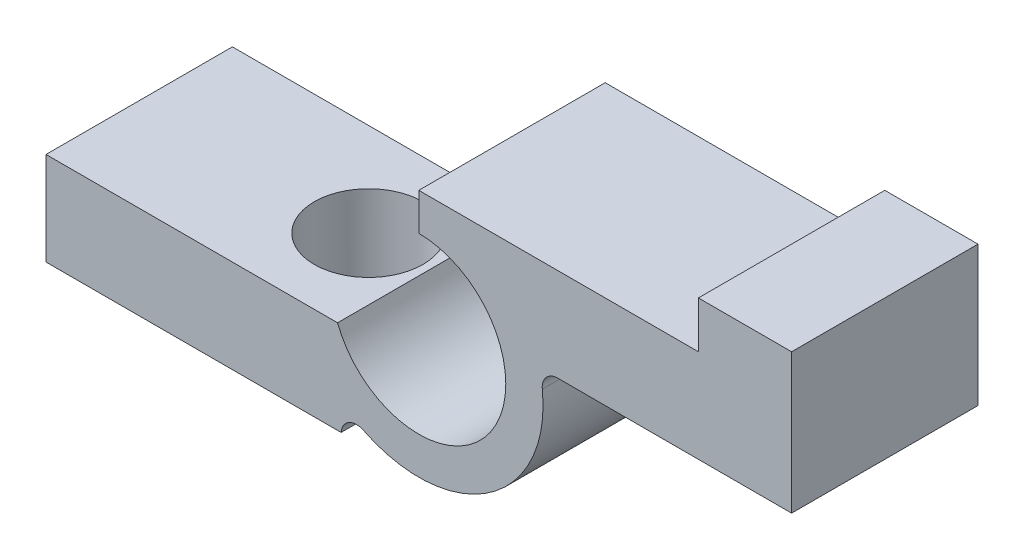
ISO-10303-21;
HEADER;
FILE_DESCRIPTION(('STEP AP214'),'2;1');
FILE_NAME('part.step','',(''),(''),'','','');
FILE_SCHEMA(('AUTOMOTIVE_DESIGN { 1 0 10303 214 1 1 1 1 }'));
ENDSEC;
DATA;
#1=APPLICATION_CONTEXT('core data for automotive mechanical design processes');
#2=APPLICATION_PROTOCOL_DEFINITION('international standard','automotive_design',2000,#1);
#3=PRODUCT_CONTEXT('',#1,'mechanical');
#4=PRODUCT('Part','Part','',(#3));
#5=PRODUCT_RELATED_PRODUCT_CATEGORY('part','',(#4));
#6=PRODUCT_DEFINITION_FORMATION('','',#4);
#7=PRODUCT_DEFINITION_CONTEXT('part definition',#1,'design');
#8=PRODUCT_DEFINITION('design','',#6,#7);
#9=PRODUCT_DEFINITION_SHAPE('','',#8);
#10=(LENGTH_UNIT() NAMED_UNIT(*) SI_UNIT(.MILLI.,.METRE.));
#11=(NAMED_UNIT(*) PLANE_ANGLE_UNIT() SI_UNIT($,.RADIAN.));
#12=(NAMED_UNIT(*) SI_UNIT($,.STERADIAN.) SOLID_ANGLE_UNIT());
#13=UNCERTAINTY_MEASURE_WITH_UNIT(LENGTH_MEASURE(1.E-05),#10,'distance_accuracy_value','');
#14=(GEOMETRIC_REPRESENTATION_CONTEXT(3) GLOBAL_UNCERTAINTY_ASSIGNED_CONTEXT((#13)) GLOBAL_UNIT_ASSIGNED_CONTEXT((#10,
#11,#12)) REPRESENTATION_CONTEXT('',''));
#15=CARTESIAN_POINT('',(0.,0.,0.));
#16=DIRECTION('',(0.,0.,1.));
#17=DIRECTION('',(1.,0.,0.));
#18=AXIS2_PLACEMENT_3D('',#15,#16,#17);
#19=CARTESIAN_POINT('',(0.,8.,6.));
#20=DIRECTION('',(0.,-1.,0.));
#21=DIRECTION('',(0.,0.,-1.));
#22=AXIS2_PLACEMENT_3D('',#19,#20,#21);
#23=PLANE('',#22);
#24=DIRECTION('',(0.,0.,1.));
#25=VECTOR('',#24,1.);
#26=CARTESIAN_POINT('',(18.,8.,0.));
#27=LINE('',#26,#25);
#28=CARTESIAN_POINT('',(18.,8.,0.));
#29=VERTEX_POINT('',#28);
#30=CARTESIAN_POINT('',(18.,8.,6.));
#31=VERTEX_POINT('',#30);
#32=EDGE_CURVE('E55',#29,#31,#27,.T.);
#33=ORIENTED_EDGE('',*,*,#32,.F.);
#34=DIRECTION('',(-1.,0.,0.));
#35=VECTOR('',#34,1.);
#36=CARTESIAN_POINT('',(0.,8.,0.));
#37=LINE('',#36,#35);
#38=CARTESIAN_POINT('',(9.,8.,0.));
#39=VERTEX_POINT('',#38);
#40=EDGE_CURVE('E159',#29,#39,#37,.T.);
#41=ORIENTED_EDGE('',*,*,#40,.T.);
#42=DIRECTION('',(0.,0.,-1.));
#43=VECTOR('',#42,1.);
#44=CARTESIAN_POINT('',(9.,8.,6.));
#45=LINE('',#44,#43);
#46=CARTESIAN_POINT('',(9.,8.,6.));
#47=VERTEX_POINT('',#46);
#48=EDGE_CURVE('E203',#47,#39,#45,.T.);
#49=ORIENTED_EDGE('',*,*,#48,.F.);
#50=DIRECTION('',(-1.,0.,0.));
#51=VECTOR('',#50,1.);
#52=CARTESIAN_POINT('',(0.,8.,6.));
#53=LINE('',#52,#51);
#54=EDGE_CURVE('E201',#31,#47,#53,.T.);
#55=ORIENTED_EDGE('',*,*,#54,.F.);
#56=EDGE_LOOP('',(#33,#41,#49,#55));
#57=FACE_BOUND('',#56,.T.);
#58=ADVANCED_FACE('F40',(#57),#23,.F.);
#59=CARTESIAN_POINT('',(0.,3.,6.));
#60=DIRECTION('',(0.,-1.,0.));
#61=DIRECTION('',(0.,0.,-1.));
#62=AXIS2_PLACEMENT_3D('',#59,#60,#61);
#63=PLANE('',#62);
#64=CARTESIAN_POINT('',(4.3846606338756,3.,3.));
#65=DIRECTION('',(0.,-1.,0.));
#66=DIRECTION('',(0.,0.,-1.));
#67=AXIS2_PLACEMENT_3D('',#64,#65,#66);
#68=CIRCLE('',#67,1.75);
#69=CARTESIAN_POINT('',(4.3846606338756,3.,1.25));
#70=VERTEX_POINT('',#69);
#71=EDGE_CURVE('E263',#70,#70,#68,.T.);
#72=ORIENTED_EDGE('',*,*,#71,.T.);
#73=EDGE_LOOP('',(#72));
#74=FACE_BOUND('',#73,.T.);
#75=DIRECTION('',(-1.,0.,0.));
#76=VECTOR('',#75,1.);
#77=CARTESIAN_POINT('',(0.,3.,0.));
#78=LINE('',#77,#76);
#79=CARTESIAN_POINT('',(6.3846606338756,3.,0.));
#80=VERTEX_POINT('',#79);
#81=CARTESIAN_POINT('',(-3.,3.,0.));
#82=VERTEX_POINT('',#81);
#83=EDGE_CURVE('E208',#80,#82,#78,.T.);
#84=ORIENTED_EDGE('',*,*,#83,.T.);
#85=DIRECTION('',(0.,0.,-1.));
#86=VECTOR('',#85,1.);
#87=CARTESIAN_POINT('',(-3.,3.,6.));
#88=LINE('',#87,#86);
#89=CARTESIAN_POINT('',(-3.,3.,6.));
#90=VERTEX_POINT('',#89);
#91=EDGE_CURVE('E172',#90,#82,#88,.T.);
#92=ORIENTED_EDGE('',*,*,#91,.F.);
#93=DIRECTION('',(-1.,0.,0.));
#94=VECTOR('',#93,1.);
#95=CARTESIAN_POINT('',(0.,3.,6.));
#96=LINE('',#95,#94);
#97=CARTESIAN_POINT('',(6.3846606338756,3.,6.));
#98=VERTEX_POINT('',#97);
#99=EDGE_CURVE('E197',#98,#90,#96,.T.);
#100=ORIENTED_EDGE('',*,*,#99,.F.);
#101=DIRECTION('',(0.,0.,-1.));
#102=VECTOR('',#101,1.);
#103=CARTESIAN_POINT('',(6.3846606338756,3.,6.));
#104=LINE('',#103,#102);
#105=EDGE_CURVE('E224',#80,#98,#104,.F.);
#106=ORIENTED_EDGE('',*,*,#105,.F.);
#107=EDGE_LOOP('',(#84,#92,#100,#106));
#108=FACE_BOUND('',#107,.T.);
#109=ADVANCED_FACE('F284',(#74,#108),#63,.F.);
#110=CARTESIAN_POINT('',(0.,0.,6.));
#111=DIRECTION('',(0.,1.,0.));
#112=DIRECTION('',(0.,0.,1.));
#113=AXIS2_PLACEMENT_3D('',#110,#111,#112);
#114=PLANE('',#113);
#115=CARTESIAN_POINT('',(4.3846606338756,0.,3.));
#116=DIRECTION('',(0.,1.,0.));
#117=DIRECTION('',(0.,0.,1.));
#118=AXIS2_PLACEMENT_3D('',#115,#116,#117);
#119=CIRCLE('',#118,1.75);
#120=CARTESIAN_POINT('',(4.3846606338756,0.,4.75));
#121=VERTEX_POINT('',#120);
#122=EDGE_CURVE('E265',#121,#121,#119,.T.);
#123=ORIENTED_EDGE('',*,*,#122,.T.);
#124=EDGE_LOOP('',(#123));
#125=FACE_BOUND('',#124,.T.);
#126=DIRECTION('',(1.,0.,0.));
#127=VECTOR('',#126,1.);
#128=CARTESIAN_POINT('',(0.,0.,0.));
#129=LINE('',#128,#127);
#130=CARTESIAN_POINT('',(-3.,0.,0.));
#131=VERTEX_POINT('',#130);
#132=CARTESIAN_POINT('',(6.5,0.,0.));
#133=VERTEX_POINT('',#132);
#134=EDGE_CURVE('E207',#131,#133,#129,.T.);
#135=ORIENTED_EDGE('',*,*,#134,.T.);
#136=DIRECTION('',(0.,0.,-1.));
#137=VECTOR('',#136,1.);
#138=CARTESIAN_POINT('',(6.5,0.,6.));
#139=LINE('',#138,#137);
#140=CARTESIAN_POINT('',(6.5,0.,6.));
#141=VERTEX_POINT('',#140);
#142=EDGE_CURVE('E216',#141,#133,#139,.T.);
#143=ORIENTED_EDGE('',*,*,#142,.F.);
#144=DIRECTION('',(1.,0.,0.));
#145=VECTOR('',#144,1.);
#146=CARTESIAN_POINT('',(0.,0.,6.));
#147=LINE('',#146,#145);
#148=CARTESIAN_POINT('',(-3.,0.,6.));
#149=VERTEX_POINT('',#148);
#150=EDGE_CURVE('E196',#149,#141,#147,.T.);
#151=ORIENTED_EDGE('',*,*,#150,.F.);
#152=DIRECTION('',(0.,0.,1.));
#153=VECTOR('',#152,1.);
#154=CARTESIAN_POINT('',(-3.,0.,0.));
#155=LINE('',#154,#153);
#156=EDGE_CURVE('E178',#131,#149,#155,.T.);
#157=ORIENTED_EDGE('',*,*,#156,.F.);
#158=EDGE_LOOP('',(#135,#143,#151,#157));
#159=FACE_BOUND('',#158,.T.);
#160=ADVANCED_FACE('F244',(#125,#159),#114,.F.);
#161=CARTESIAN_POINT('',(9.,4.,6.));
#162=DIRECTION('',(0.,0.,-1.));
#163=DIRECTION('',(-1.,0.,0.));
#164=AXIS2_PLACEMENT_3D('',#161,#162,#163);
#165=CYLINDRICAL_SURFACE('',#164,4.);
#166=CARTESIAN_POINT('',(9.,4.,0.));
#167=DIRECTION('',(0.,0.,1.));
#168=DIRECTION('',(1.,0.,0.));
#169=AXIS2_PLACEMENT_3D('',#166,#167,#168);
#170=CIRCLE('',#169,4.);
#171=CARTESIAN_POINT('',(7.22138574685198,0.417189463773072,0.));
#172=VERTEX_POINT('',#171);
#173=CARTESIAN_POINT('',(12.9752319599996,4.44444444444445,0.));
#174=VERTEX_POINT('',#173);
#175=EDGE_CURVE('E204',#172,#174,#170,.T.);
#176=ORIENTED_EDGE('',*,*,#175,.T.);
#177=DIRECTION('',(0.,0.,-1.));
#178=VECTOR('',#177,1.);
#179=CARTESIAN_POINT('',(12.9752319599996,4.44444444444445,6.));
#180=LINE('',#179,#178);
#181=CARTESIAN_POINT('',(12.9752319599996,4.44444444444445,6.));
#182=VERTEX_POINT('',#181);
#183=EDGE_CURVE('E63',#174,#182,#180,.F.);
#184=ORIENTED_EDGE('',*,*,#183,.T.);
#185=CARTESIAN_POINT('',(9.,4.,6.));
#186=DIRECTION('',(0.,0.,1.));
#187=DIRECTION('',(1.,0.,0.));
#188=AXIS2_PLACEMENT_3D('',#185,#186,#187);
#189=CIRCLE('',#188,4.);
#190=CARTESIAN_POINT('',(7.22138574685198,0.417189463773072,6.));
#191=VERTEX_POINT('',#190);
#192=EDGE_CURVE('E193',#191,#182,#189,.T.);
#193=ORIENTED_EDGE('',*,*,#192,.F.);
#194=DIRECTION('',(0.,0.,-1.));
#195=VECTOR('',#194,1.);
#196=CARTESIAN_POINT('',(7.22138574685198,0.417189463773072,6.));
#197=LINE('',#196,#195);
#198=EDGE_CURVE('E230',#191,#172,#197,.T.);
#199=ORIENTED_EDGE('',*,*,#198,.T.);
#200=EDGE_LOOP('',(#176,#184,#193,#199));
#201=FACE_BOUND('',#200,.T.);
#202=ADVANCED_FACE('F250',(#201),#165,.T.);
#203=CARTESIAN_POINT('',(0.,5.,6.));
#204=DIRECTION('',(0.,1.,0.));
#205=DIRECTION('',(0.,0.,1.));
#206=AXIS2_PLACEMENT_3D('',#203,#204,#205);
#207=PLANE('',#206);
#208=DIRECTION('',(1.,0.,0.));
#209=VECTOR('',#208,1.);
#210=CARTESIAN_POINT('',(0.,5.,6.));
#211=LINE('',#210,#209);
#212=CARTESIAN_POINT('',(13.4721359549996,5.,6.));
#213=VERTEX_POINT('',#212);
#214=CARTESIAN_POINT('',(21.,5.,6.));
#215=VERTEX_POINT('',#214);
#216=EDGE_CURVE('E195',#213,#215,#211,.T.);
#217=ORIENTED_EDGE('',*,*,#216,.F.);
#218=DIRECTION('',(0.,0.,1.));
#219=VECTOR('',#218,1.);
#220=CARTESIAN_POINT('',(13.4721359549996,5.,0.));
#221=LINE('',#220,#219);
#222=CARTESIAN_POINT('',(13.4721359549996,5.,0.));
#223=VERTEX_POINT('',#222);
#224=EDGE_CURVE('E227',#213,#223,#221,.F.);
#225=ORIENTED_EDGE('',*,*,#224,.T.);
#226=DIRECTION('',(1.,0.,0.));
#227=VECTOR('',#226,1.);
#228=CARTESIAN_POINT('',(0.,5.,0.));
#229=LINE('',#228,#227);
#230=CARTESIAN_POINT('',(21.,5.,0.));
#231=VERTEX_POINT('',#230);
#232=EDGE_CURVE('E206',#223,#231,#229,.T.);
#233=ORIENTED_EDGE('',*,*,#232,.T.);
#234=DIRECTION('',(0.,0.,-1.));
#235=VECTOR('',#234,1.);
#236=CARTESIAN_POINT('',(21.,5.,6.));
#237=LINE('',#236,#235);
#238=EDGE_CURVE('E160',#215,#231,#237,.T.);
#239=ORIENTED_EDGE('',*,*,#238,.F.);
#240=EDGE_LOOP('',(#217,#225,#233,#239));
#241=FACE_BOUND('',#240,.T.);
#242=ADVANCED_FACE('F257',(#241),#207,.F.);
#243=CARTESIAN_POINT('',(0.,0.,6.));
#244=DIRECTION('',(0.,0.,1.));
#245=DIRECTION('',(1.,0.,0.));
#246=AXIS2_PLACEMENT_3D('',#243,#244,#245);
#247=PLANE('',#246);
#248=CARTESIAN_POINT('',(9.,4.,6.));
#249=DIRECTION('',(0.,0.,-1.));
#250=DIRECTION('',(-1.,0.,0.));
#251=AXIS2_PLACEMENT_3D('',#248,#249,#250);
#252=CIRCLE('',#251,2.8);
#253=CARTESIAN_POINT('',(9.,6.8,6.));
#254=VERTEX_POINT('',#253);
#255=EDGE_CURVE('E189',#254,#98,#252,.T.);
#256=ORIENTED_EDGE('',*,*,#255,.T.);
#257=ORIENTED_EDGE('',*,*,#99,.T.);
#258=DIRECTION('',(0.,1.,0.));
#259=VECTOR('',#258,1.);
#260=CARTESIAN_POINT('',(-3.,0.,6.));
#261=LINE('',#260,#259);
#262=EDGE_CURVE('E181',#149,#90,#261,.T.);
#263=ORIENTED_EDGE('',*,*,#262,.F.);
#264=ORIENTED_EDGE('',*,*,#150,.T.);
#265=CARTESIAN_POINT('',(6.99905896520847,-0.0306618532552948,6.));
#266=DIRECTION('',(0.,0.,1.));
#267=DIRECTION('',(1.,0.,0.));
#268=AXIS2_PLACEMENT_3D('',#265,#266,#267);
#269=CIRCLE('',#268,0.5);
#270=EDGE_CURVE('E11',#141,#191,#269,.F.);
#271=ORIENTED_EDGE('',*,*,#270,.T.);
#272=ORIENTED_EDGE('',*,*,#192,.T.);
#273=CARTESIAN_POINT('',(13.4721359549996,4.5,6.));
#274=DIRECTION('',(0.,0.,1.));
#275=DIRECTION('',(1.,0.,0.));
#276=AXIS2_PLACEMENT_3D('',#273,#274,#275);
#277=CIRCLE('',#276,0.5);
#278=EDGE_CURVE('E236',#182,#213,#277,.F.);
#279=ORIENTED_EDGE('',*,*,#278,.T.);
#280=ORIENTED_EDGE('',*,*,#216,.T.);
#281=DIRECTION('',(0.,-1.,0.));
#282=VECTOR('',#281,1.);
#283=CARTESIAN_POINT('',(21.,8.,6.));
#284=LINE('',#283,#282);
#285=CARTESIAN_POINT('',(21.,9.5,6.));
#286=VERTEX_POINT('',#285);
#287=EDGE_CURVE('E169',#286,#215,#284,.T.);
#288=ORIENTED_EDGE('',*,*,#287,.F.);
#289=DIRECTION('',(1.,0.,0.));
#290=VECTOR('',#289,1.);
#291=CARTESIAN_POINT('',(18.,9.5,6.));
#292=LINE('',#291,#290);
#293=CARTESIAN_POINT('',(18.,9.5,6.));
#294=VERTEX_POINT('',#293);
#295=EDGE_CURVE('E146',#294,#286,#292,.T.);
#296=ORIENTED_EDGE('',*,*,#295,.F.);
#297=DIRECTION('',(0.,-1.,0.));
#298=VECTOR('',#297,1.);
#299=CARTESIAN_POINT('',(18.,9.5,6.));
#300=LINE('',#299,#298);
#301=EDGE_CURVE('E142',#294,#31,#300,.T.);
#302=ORIENTED_EDGE('',*,*,#301,.T.);
#303=ORIENTED_EDGE('',*,*,#54,.T.);
#304=DIRECTION('',(0.,-1.,0.));
#305=VECTOR('',#304,1.);
#306=CARTESIAN_POINT('',(9.,3.,6.));
#307=LINE('',#306,#305);
#308=EDGE_CURVE('E184',#47,#254,#307,.T.);
#309=ORIENTED_EDGE('',*,*,#308,.T.);
#310=EDGE_LOOP('',(#256,#257,#263,#264,#271,#272,#279,#280,#288,#296,#302,#303,#309));
#311=FACE_BOUND('',#310,.T.);
#312=ADVANCED_FACE('F247',(#311),#247,.T.);
#313=CARTESIAN_POINT('',(0.,0.,0.));
#314=DIRECTION('',(0.,0.,1.));
#315=DIRECTION('',(1.,0.,0.));
#316=AXIS2_PLACEMENT_3D('',#313,#314,#315);
#317=PLANE('',#316);
#318=ORIENTED_EDGE('',*,*,#83,.F.);
#319=CARTESIAN_POINT('',(9.,4.,0.));
#320=DIRECTION('',(0.,0.,1.));
#321=DIRECTION('',(1.,0.,0.));
#322=AXIS2_PLACEMENT_3D('',#319,#320,#321);
#323=CIRCLE('',#322,2.8);
#324=CARTESIAN_POINT('',(9.,6.8,0.));
#325=VERTEX_POINT('',#324);
#326=EDGE_CURVE('E192',#80,#325,#323,.T.);
#327=ORIENTED_EDGE('',*,*,#326,.T.);
#328=DIRECTION('',(0.,1.,0.));
#329=VECTOR('',#328,1.);
#330=CARTESIAN_POINT('',(9.,0.,0.));
#331=LINE('',#330,#329);
#332=EDGE_CURVE('E187',#325,#39,#331,.T.);
#333=ORIENTED_EDGE('',*,*,#332,.T.);
#334=ORIENTED_EDGE('',*,*,#40,.F.);
#335=DIRECTION('',(0.,-1.,0.));
#336=VECTOR('',#335,1.);
#337=CARTESIAN_POINT('',(18.,9.5,0.));
#338=LINE('',#337,#336);
#339=CARTESIAN_POINT('',(18.,9.5,0.));
#340=VERTEX_POINT('',#339);
#341=EDGE_CURVE('E140',#340,#29,#338,.T.);
#342=ORIENTED_EDGE('',*,*,#341,.F.);
#343=DIRECTION('',(-1.,0.,0.));
#344=VECTOR('',#343,1.);
#345=CARTESIAN_POINT('',(21.,9.5,0.));
#346=LINE('',#345,#344);
#347=CARTESIAN_POINT('',(21.,9.5,0.));
#348=VERTEX_POINT('',#347);
#349=EDGE_CURVE('E147',#348,#340,#346,.T.);
#350=ORIENTED_EDGE('',*,*,#349,.F.);
#351=DIRECTION('',(0.,1.,0.));
#352=VECTOR('',#351,1.);
#353=CARTESIAN_POINT('',(21.,5.,0.));
#354=LINE('',#353,#352);
#355=EDGE_CURVE('E163',#231,#348,#354,.T.);
#356=ORIENTED_EDGE('',*,*,#355,.F.);
#357=ORIENTED_EDGE('',*,*,#232,.F.);
#358=CARTESIAN_POINT('',(13.4721359549996,4.5,0.));
#359=DIRECTION('',(0.,0.,1.));
#360=DIRECTION('',(1.,0.,0.));
#361=AXIS2_PLACEMENT_3D('',#358,#359,#360);
#362=CIRCLE('',#361,0.5);
#363=EDGE_CURVE('E234',#223,#174,#362,.T.);
#364=ORIENTED_EDGE('',*,*,#363,.T.);
#365=ORIENTED_EDGE('',*,*,#175,.F.);
#366=CARTESIAN_POINT('',(6.99905896520847,-0.0306618532552948,0.));
#367=DIRECTION('',(0.,0.,1.));
#368=DIRECTION('',(1.,0.,0.));
#369=AXIS2_PLACEMENT_3D('',#366,#367,#368);
#370=CIRCLE('',#369,0.5);
#371=EDGE_CURVE('E48',#172,#133,#370,.T.);
#372=ORIENTED_EDGE('',*,*,#371,.T.);
#373=ORIENTED_EDGE('',*,*,#134,.F.);
#374=DIRECTION('',(0.,-1.,0.));
#375=VECTOR('',#374,1.);
#376=CARTESIAN_POINT('',(-3.,3.,0.));
#377=LINE('',#376,#375);
#378=EDGE_CURVE('E175',#82,#131,#377,.T.);
#379=ORIENTED_EDGE('',*,*,#378,.F.);
#380=EDGE_LOOP('',(#318,#327,#333,#334,#342,#350,#356,#357,#364,#365,#372,#373,#379));
#381=FACE_BOUND('',#380,.T.);
#382=ADVANCED_FACE('F157',(#381),#317,.F.);
#383=CARTESIAN_POINT('',(9.,4.,6.));
#384=DIRECTION('',(0.,0.,-1.));
#385=DIRECTION('',(-1.,0.,0.));
#386=AXIS2_PLACEMENT_3D('',#383,#384,#385);
#387=CYLINDRICAL_SURFACE('',#386,2.8);
#388=ORIENTED_EDGE('',*,*,#326,.F.);
#389=ORIENTED_EDGE('',*,*,#105,.T.);
#390=ORIENTED_EDGE('',*,*,#255,.F.);
#391=DIRECTION('',(0.,0.,-1.));
#392=VECTOR('',#391,1.);
#393=CARTESIAN_POINT('',(9.,6.8,6.));
#394=LINE('',#393,#392);
#395=EDGE_CURVE('E219',#254,#325,#394,.T.);
#396=ORIENTED_EDGE('',*,*,#395,.T.);
#397=EDGE_LOOP('',(#388,#389,#390,#396));
#398=FACE_BOUND('',#397,.T.);
#399=ADVANCED_FACE('F305',(#398),#387,.F.);
#400=CARTESIAN_POINT('',(9.,3.,6.));
#401=DIRECTION('',(1.,0.,0.));
#402=DIRECTION('',(0.,0.,-1.));
#403=AXIS2_PLACEMENT_3D('',#400,#401,#402);
#404=PLANE('',#403);
#405=ORIENTED_EDGE('',*,*,#332,.F.);
#406=ORIENTED_EDGE('',*,*,#395,.F.);
#407=ORIENTED_EDGE('',*,*,#308,.F.);
#408=ORIENTED_EDGE('',*,*,#48,.T.);
#409=EDGE_LOOP('',(#405,#406,#407,#408));
#410=FACE_BOUND('',#409,.T.);
#411=ADVANCED_FACE('F299',(#410),#404,.F.);
#412=CARTESIAN_POINT('',(13.4721359549996,4.5,6.));
#413=DIRECTION('',(0.,0.,-1.));
#414=DIRECTION('',(-1.,0.,0.));
#415=AXIS2_PLACEMENT_3D('',#412,#413,#414);
#416=CYLINDRICAL_SURFACE('',#415,0.5);
#417=ORIENTED_EDGE('',*,*,#278,.F.);
#418=ORIENTED_EDGE('',*,*,#183,.F.);
#419=ORIENTED_EDGE('',*,*,#363,.F.);
#420=ORIENTED_EDGE('',*,*,#224,.F.);
#421=EDGE_LOOP('',(#417,#418,#419,#420));
#422=FACE_BOUND('',#421,.T.);
#423=ADVANCED_FACE('F252',(#422),#416,.F.);
#424=CARTESIAN_POINT('',(6.99905896520847,-0.0306618532552948,6.));
#425=DIRECTION('',(0.,0.,1.));
#426=DIRECTION('',(1.,0.,0.));
#427=AXIS2_PLACEMENT_3D('',#424,#425,#426);
#428=CYLINDRICAL_SURFACE('',#427,0.5);
#429=ORIENTED_EDGE('',*,*,#270,.F.);
#430=ORIENTED_EDGE('',*,*,#142,.T.);
#431=ORIENTED_EDGE('',*,*,#371,.F.);
#432=ORIENTED_EDGE('',*,*,#198,.F.);
#433=EDGE_LOOP('',(#429,#430,#431,#432));
#434=FACE_BOUND('',#433,.T.);
#435=ADVANCED_FACE('F42',(#434),#428,.F.);
#436=CARTESIAN_POINT('',(-3.,0.,0.));
#437=DIRECTION('',(-1.,0.,0.));
#438=DIRECTION('',(0.,0.,1.));
#439=AXIS2_PLACEMENT_3D('',#436,#437,#438);
#440=PLANE('',#439);
#441=ORIENTED_EDGE('',*,*,#91,.T.);
#442=ORIENTED_EDGE('',*,*,#378,.T.);
#443=ORIENTED_EDGE('',*,*,#156,.T.);
#444=ORIENTED_EDGE('',*,*,#262,.T.);
#445=EDGE_LOOP('',(#441,#442,#443,#444));
#446=FACE_BOUND('',#445,.T.);
#447=ADVANCED_FACE('F303',(#446),#440,.T.);
#448=CARTESIAN_POINT('',(21.,0.,0.));
#449=DIRECTION('',(1.,0.,0.));
#450=DIRECTION('',(0.,0.,-1.));
#451=AXIS2_PLACEMENT_3D('',#448,#449,#450);
#452=PLANE('',#451);
#453=ORIENTED_EDGE('',*,*,#238,.T.);
#454=ORIENTED_EDGE('',*,*,#355,.T.);
#455=DIRECTION('',(0.,0.,-1.));
#456=VECTOR('',#455,1.);
#457=CARTESIAN_POINT('',(21.,9.5,6.));
#458=LINE('',#457,#456);
#459=EDGE_CURVE('E153',#286,#348,#458,.T.);
#460=ORIENTED_EDGE('',*,*,#459,.F.);
#461=ORIENTED_EDGE('',*,*,#287,.T.);
#462=EDGE_LOOP('',(#453,#454,#460,#461));
#463=FACE_BOUND('',#462,.T.);
#464=ADVANCED_FACE('F260',(#463),#452,.T.);
#465=CARTESIAN_POINT('',(18.,9.5,0.));
#466=DIRECTION('',(1.,0.,0.));
#467=DIRECTION('',(0.,0.,-1.));
#468=AXIS2_PLACEMENT_3D('',#465,#466,#467);
#469=PLANE('',#468);
#470=ORIENTED_EDGE('',*,*,#32,.T.);
#471=ORIENTED_EDGE('',*,*,#301,.F.);
#472=DIRECTION('',(0.,0.,1.));
#473=VECTOR('',#472,1.);
#474=CARTESIAN_POINT('',(18.,9.5,0.));
#475=LINE('',#474,#473);
#476=EDGE_CURVE('E136',#340,#294,#475,.T.);
#477=ORIENTED_EDGE('',*,*,#476,.F.);
#478=ORIENTED_EDGE('',*,*,#341,.T.);
#479=EDGE_LOOP('',(#470,#471,#477,#478));
#480=FACE_BOUND('',#479,.T.);
#481=ADVANCED_FACE('F138',(#480),#469,.F.);
#482=CARTESIAN_POINT('',(0.,9.5,0.));
#483=DIRECTION('',(0.,1.,0.));
#484=DIRECTION('',(0.,0.,1.));
#485=AXIS2_PLACEMENT_3D('',#482,#483,#484);
#486=PLANE('',#485);
#487=ORIENTED_EDGE('',*,*,#349,.T.);
#488=ORIENTED_EDGE('',*,*,#476,.T.);
#489=ORIENTED_EDGE('',*,*,#295,.T.);
#490=ORIENTED_EDGE('',*,*,#459,.T.);
#491=EDGE_LOOP('',(#487,#488,#489,#490));
#492=FACE_BOUND('',#491,.T.);
#493=ADVANCED_FACE('F151',(#492),#486,.T.);
#494=CARTESIAN_POINT('',(4.3846606338756,0.,3.));
#495=DIRECTION('',(0.,1.,0.));
#496=DIRECTION('',(0.,0.,1.));
#497=AXIS2_PLACEMENT_3D('',#494,#495,#496);
#498=CYLINDRICAL_SURFACE('',#497,1.75);
#499=ORIENTED_EDGE('',*,*,#122,.F.);
#500=EDGE_LOOP('',(#499));
#501=FACE_BOUND('',#500,.T.);
#502=ORIENTED_EDGE('',*,*,#71,.F.);
#503=EDGE_LOOP('',(#502));
#504=FACE_BOUND('',#503,.T.);
#505=ADVANCED_FACE('F274',(#501,#504),#498,.F.);
#506=CLOSED_SHELL('',(#58,#109,#160,#202,#242,#312,#382,#399,#411,#423,#435,#447,#464,#481,#493,#505));
#507=MANIFOLD_SOLID_BREP('B2',#506);
#508=ADVANCED_BREP_SHAPE_REPRESENTATION('',(#18,#507),#14);
#509=SHAPE_DEFINITION_REPRESENTATION(#9,#508);
ENDSEC;
END-ISO-10303-21;
